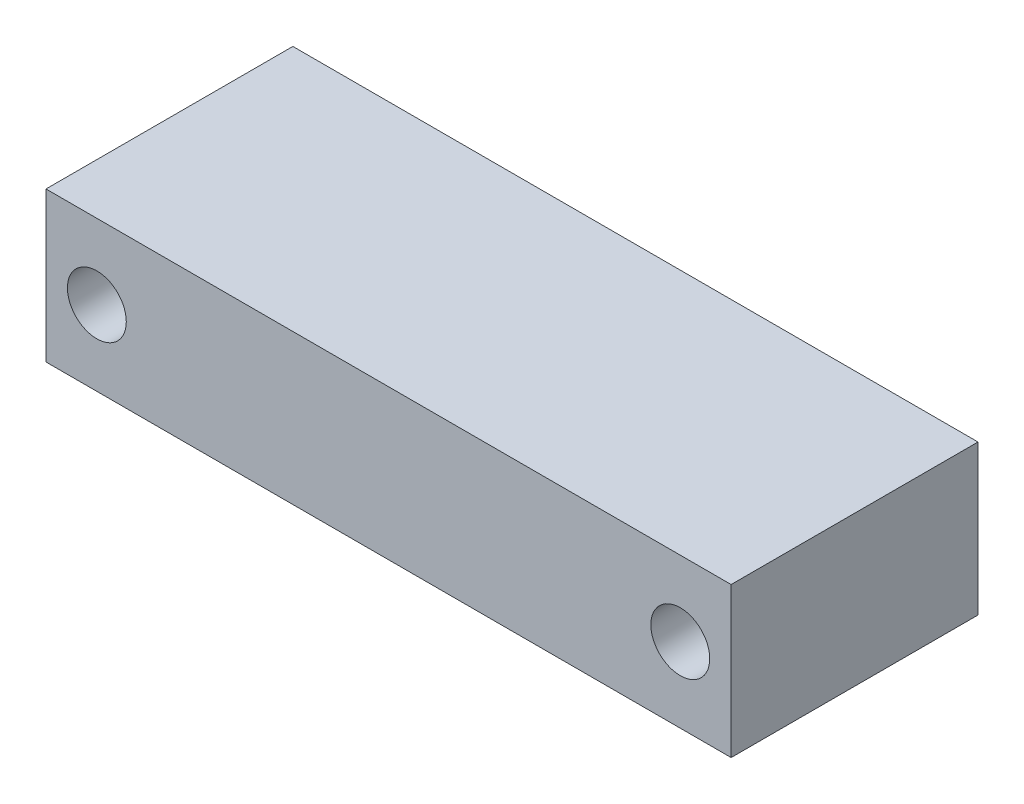
ISO-10303-21;
HEADER;
FILE_DESCRIPTION(('STEP AP214'),'2;1');
FILE_NAME('part.step','',(''),(''),'','','');
FILE_SCHEMA(('AUTOMOTIVE_DESIGN { 1 0 10303 214 1 1 1 1 }'));
ENDSEC;
DATA;
#1=APPLICATION_CONTEXT('core data for automotive mechanical design processes');
#2=APPLICATION_PROTOCOL_DEFINITION('international standard','automotive_design',2000,#1);
#3=PRODUCT_CONTEXT('',#1,'mechanical');
#4=PRODUCT('Part','Part','',(#3));
#5=PRODUCT_RELATED_PRODUCT_CATEGORY('part','',(#4));
#6=PRODUCT_DEFINITION_FORMATION('','',#4);
#7=PRODUCT_DEFINITION_CONTEXT('part definition',#1,'design');
#8=PRODUCT_DEFINITION('design','',#6,#7);
#9=PRODUCT_DEFINITION_SHAPE('','',#8);
#10=(LENGTH_UNIT() NAMED_UNIT(*) SI_UNIT(.MILLI.,.METRE.));
#11=(NAMED_UNIT(*) PLANE_ANGLE_UNIT() SI_UNIT($,.RADIAN.));
#12=(NAMED_UNIT(*) SI_UNIT($,.STERADIAN.) SOLID_ANGLE_UNIT());
#13=UNCERTAINTY_MEASURE_WITH_UNIT(LENGTH_MEASURE(1.E-05),#10,'distance_accuracy_value','');
#14=(GEOMETRIC_REPRESENTATION_CONTEXT(3) GLOBAL_UNCERTAINTY_ASSIGNED_CONTEXT((#13)) GLOBAL_UNIT_ASSIGNED_CONTEXT((#10,
#11,#12)) REPRESENTATION_CONTEXT('',''));
#15=CARTESIAN_POINT('',(0.,0.,0.));
#16=DIRECTION('',(0.,0.,1.));
#17=DIRECTION('',(1.,0.,0.));
#18=AXIS2_PLACEMENT_3D('',#15,#16,#17);
#19=CARTESIAN_POINT('',(0.,0.,23.06));
#20=DIRECTION('',(0.,0.,-1.));
#21=DIRECTION('',(-1.,0.,0.));
#22=AXIS2_PLACEMENT_3D('',#19,#20,#21);
#23=PLANE('',#22);
#24=DIRECTION('',(0.,1.,0.));
#25=VECTOR('',#24,1.);
#26=CARTESIAN_POINT('',(32.,-7.,23.06));
#27=LINE('',#26,#25);
#28=CARTESIAN_POINT('',(32.,-7.,23.06));
#29=VERTEX_POINT('',#28);
#30=CARTESIAN_POINT('',(32.,7.,23.06));
#31=VERTEX_POINT('',#30);
#32=EDGE_CURVE('E86',#29,#31,#27,.T.);
#33=ORIENTED_EDGE('',*,*,#32,.T.);
#34=DIRECTION('',(-1.,0.,0.));
#35=VECTOR('',#34,1.);
#36=CARTESIAN_POINT('',(-32.,7.,23.06));
#37=LINE('',#36,#35);
#38=CARTESIAN_POINT('',(-32.,7.,23.06));
#39=VERTEX_POINT('',#38);
#40=EDGE_CURVE('E81',#31,#39,#37,.T.);
#41=ORIENTED_EDGE('',*,*,#40,.T.);
#42=DIRECTION('',(0.,-1.,0.));
#43=VECTOR('',#42,1.);
#44=CARTESIAN_POINT('',(-32.,-7.,23.06));
#45=LINE('',#44,#43);
#46=CARTESIAN_POINT('',(-32.,-7.,23.06));
#47=VERTEX_POINT('',#46);
#48=EDGE_CURVE('E84',#39,#47,#45,.T.);
#49=ORIENTED_EDGE('',*,*,#48,.T.);
#50=DIRECTION('',(1.,0.,0.));
#51=VECTOR('',#50,1.);
#52=CARTESIAN_POINT('',(-32.,-7.,23.06));
#53=LINE('',#52,#51);
#54=EDGE_CURVE('E51',#47,#29,#53,.T.);
#55=ORIENTED_EDGE('',*,*,#54,.T.);
#56=EDGE_LOOP('',(#33,#41,#49,#55));
#57=FACE_BOUND('',#56,.T.);
#58=CARTESIAN_POINT('',(-27.25,0.,23.06));
#59=DIRECTION('',(0.,0.,1.));
#60=DIRECTION('',(1.,0.,0.));
#61=AXIS2_PLACEMENT_3D('',#58,#59,#60);
#62=CIRCLE('',#61,2.75);
#63=CARTESIAN_POINT('',(-24.5,0.,23.06));
#64=VERTEX_POINT('',#63);
#65=EDGE_CURVE('E101',#64,#64,#62,.T.);
#66=ORIENTED_EDGE('',*,*,#65,.F.);
#67=EDGE_LOOP('',(#66));
#68=FACE_BOUND('',#67,.T.);
#69=CARTESIAN_POINT('',(27.25,0.,23.06));
#70=DIRECTION('',(0.,0.,1.));
#71=DIRECTION('',(1.,0.,0.));
#72=AXIS2_PLACEMENT_3D('',#69,#70,#71);
#73=CIRCLE('',#72,2.75);
#74=CARTESIAN_POINT('',(30.,0.,23.06));
#75=VERTEX_POINT('',#74);
#76=EDGE_CURVE('E116',#75,#75,#73,.T.);
#77=ORIENTED_EDGE('',*,*,#76,.F.);
#78=EDGE_LOOP('',(#77));
#79=FACE_BOUND('',#78,.T.);
#80=ADVANCED_FACE('F34',(#57,#68,#79),#23,.F.);
#81=CARTESIAN_POINT('',(0.,0.,0.));
#82=DIRECTION('',(0.,0.,-1.));
#83=DIRECTION('',(-1.,0.,0.));
#84=AXIS2_PLACEMENT_3D('',#81,#82,#83);
#85=PLANE('',#84);
#86=CARTESIAN_POINT('',(-27.25,0.,0.));
#87=DIRECTION('',(0.,0.,1.));
#88=DIRECTION('',(1.,0.,0.));
#89=AXIS2_PLACEMENT_3D('',#86,#87,#88);
#90=CIRCLE('',#89,2.75);
#91=CARTESIAN_POINT('',(-24.5,0.,0.));
#92=VERTEX_POINT('',#91);
#93=EDGE_CURVE('E113',#92,#92,#90,.T.);
#94=ORIENTED_EDGE('',*,*,#93,.T.);
#95=EDGE_LOOP('',(#94));
#96=FACE_BOUND('',#95,.T.);
#97=DIRECTION('',(0.,1.,0.));
#98=VECTOR('',#97,1.);
#99=CARTESIAN_POINT('',(32.,-7.,0.));
#100=LINE('',#99,#98);
#101=CARTESIAN_POINT('',(32.,-7.,0.));
#102=VERTEX_POINT('',#101);
#103=CARTESIAN_POINT('',(32.,7.,0.));
#104=VERTEX_POINT('',#103);
#105=EDGE_CURVE('E98',#102,#104,#100,.T.);
#106=ORIENTED_EDGE('',*,*,#105,.F.);
#107=DIRECTION('',(1.,0.,0.));
#108=VECTOR('',#107,1.);
#109=CARTESIAN_POINT('',(-32.,-7.,0.));
#110=LINE('',#109,#108);
#111=CARTESIAN_POINT('',(-32.,-7.,0.));
#112=VERTEX_POINT('',#111);
#113=EDGE_CURVE('E74',#112,#102,#110,.T.);
#114=ORIENTED_EDGE('',*,*,#113,.F.);
#115=DIRECTION('',(0.,-1.,0.));
#116=VECTOR('',#115,1.);
#117=CARTESIAN_POINT('',(-32.,-7.,0.));
#118=LINE('',#117,#116);
#119=CARTESIAN_POINT('',(-32.,7.,0.));
#120=VERTEX_POINT('',#119);
#121=EDGE_CURVE('E68',#120,#112,#118,.T.);
#122=ORIENTED_EDGE('',*,*,#121,.F.);
#123=DIRECTION('',(-1.,0.,0.));
#124=VECTOR('',#123,1.);
#125=CARTESIAN_POINT('',(-32.,7.,0.));
#126=LINE('',#125,#124);
#127=EDGE_CURVE('E90',#104,#120,#126,.T.);
#128=ORIENTED_EDGE('',*,*,#127,.F.);
#129=EDGE_LOOP('',(#106,#114,#122,#128));
#130=FACE_BOUND('',#129,.T.);
#131=CARTESIAN_POINT('',(27.25,0.,0.));
#132=DIRECTION('',(0.,0.,1.));
#133=DIRECTION('',(1.,0.,0.));
#134=AXIS2_PLACEMENT_3D('',#131,#132,#133);
#135=CIRCLE('',#134,2.75);
#136=CARTESIAN_POINT('',(30.,0.,0.));
#137=VERTEX_POINT('',#136);
#138=EDGE_CURVE('E119',#137,#137,#135,.T.);
#139=ORIENTED_EDGE('',*,*,#138,.T.);
#140=EDGE_LOOP('',(#139));
#141=FACE_BOUND('',#140,.T.);
#142=ADVANCED_FACE('F109',(#96,#130,#141),#85,.T.);
#143=CARTESIAN_POINT('',(32.,-7.,23.06));
#144=DIRECTION('',(-1.,0.,0.));
#145=DIRECTION('',(0.,0.,1.));
#146=AXIS2_PLACEMENT_3D('',#143,#144,#145);
#147=PLANE('',#146);
#148=ORIENTED_EDGE('',*,*,#105,.T.);
#149=DIRECTION('',(0.,0.,-1.));
#150=VECTOR('',#149,1.);
#151=CARTESIAN_POINT('',(32.,7.,23.06));
#152=LINE('',#151,#150);
#153=EDGE_CURVE('E11',#31,#104,#152,.T.);
#154=ORIENTED_EDGE('',*,*,#153,.F.);
#155=ORIENTED_EDGE('',*,*,#32,.F.);
#156=DIRECTION('',(0.,0.,-1.));
#157=VECTOR('',#156,1.);
#158=CARTESIAN_POINT('',(32.,-7.,23.06));
#159=LINE('',#158,#157);
#160=EDGE_CURVE('E94',#29,#102,#159,.T.);
#161=ORIENTED_EDGE('',*,*,#160,.T.);
#162=EDGE_LOOP('',(#148,#154,#155,#161));
#163=FACE_BOUND('',#162,.T.);
#164=ADVANCED_FACE('F36',(#163),#147,.F.);
#165=CARTESIAN_POINT('',(-32.,7.,23.06));
#166=DIRECTION('',(0.,-1.,0.));
#167=DIRECTION('',(0.,0.,-1.));
#168=AXIS2_PLACEMENT_3D('',#165,#166,#167);
#169=PLANE('',#168);
#170=ORIENTED_EDGE('',*,*,#127,.T.);
#171=DIRECTION('',(0.,0.,-1.));
#172=VECTOR('',#171,1.);
#173=CARTESIAN_POINT('',(-32.,7.,23.06));
#174=LINE('',#173,#172);
#175=EDGE_CURVE('E43',#39,#120,#174,.T.);
#176=ORIENTED_EDGE('',*,*,#175,.F.);
#177=ORIENTED_EDGE('',*,*,#40,.F.);
#178=ORIENTED_EDGE('',*,*,#153,.T.);
#179=EDGE_LOOP('',(#170,#176,#177,#178));
#180=FACE_BOUND('',#179,.T.);
#181=ADVANCED_FACE('F89',(#180),#169,.F.);
#182=CARTESIAN_POINT('',(-32.,-7.,23.06));
#183=DIRECTION('',(1.,0.,0.));
#184=DIRECTION('',(0.,0.,-1.));
#185=AXIS2_PLACEMENT_3D('',#182,#183,#184);
#186=PLANE('',#185);
#187=ORIENTED_EDGE('',*,*,#121,.T.);
#188=DIRECTION('',(0.,0.,-1.));
#189=VECTOR('',#188,1.);
#190=CARTESIAN_POINT('',(-32.,-7.,23.06));
#191=LINE('',#190,#189);
#192=EDGE_CURVE('E91',#47,#112,#191,.T.);
#193=ORIENTED_EDGE('',*,*,#192,.F.);
#194=ORIENTED_EDGE('',*,*,#48,.F.);
#195=ORIENTED_EDGE('',*,*,#175,.T.);
#196=EDGE_LOOP('',(#187,#193,#194,#195));
#197=FACE_BOUND('',#196,.T.);
#198=ADVANCED_FACE('F92',(#197),#186,.F.);
#199=CARTESIAN_POINT('',(-32.,-7.,23.06));
#200=DIRECTION('',(0.,1.,0.));
#201=DIRECTION('',(0.,0.,1.));
#202=AXIS2_PLACEMENT_3D('',#199,#200,#201);
#203=PLANE('',#202);
#204=ORIENTED_EDGE('',*,*,#113,.T.);
#205=ORIENTED_EDGE('',*,*,#160,.F.);
#206=ORIENTED_EDGE('',*,*,#54,.F.);
#207=ORIENTED_EDGE('',*,*,#192,.T.);
#208=EDGE_LOOP('',(#204,#205,#206,#207));
#209=FACE_BOUND('',#208,.T.);
#210=ADVANCED_FACE('F106',(#209),#203,.F.);
#211=CARTESIAN_POINT('',(-27.25,0.,23.06));
#212=DIRECTION('',(0.,0.,-1.));
#213=DIRECTION('',(-1.,0.,0.));
#214=AXIS2_PLACEMENT_3D('',#211,#212,#213);
#215=CYLINDRICAL_SURFACE('',#214,2.75);
#216=ORIENTED_EDGE('',*,*,#65,.T.);
#217=EDGE_LOOP('',(#216));
#218=FACE_BOUND('',#217,.T.);
#219=ORIENTED_EDGE('',*,*,#93,.F.);
#220=EDGE_LOOP('',(#219));
#221=FACE_BOUND('',#220,.T.);
#222=ADVANCED_FACE('F136',(#218,#221),#215,.F.);
#223=CARTESIAN_POINT('',(27.25,0.,23.06));
#224=DIRECTION('',(0.,0.,-1.));
#225=DIRECTION('',(-1.,0.,0.));
#226=AXIS2_PLACEMENT_3D('',#223,#224,#225);
#227=CYLINDRICAL_SURFACE('',#226,2.75);
#228=ORIENTED_EDGE('',*,*,#76,.T.);
#229=EDGE_LOOP('',(#228));
#230=FACE_BOUND('',#229,.T.);
#231=ORIENTED_EDGE('',*,*,#138,.F.);
#232=EDGE_LOOP('',(#231));
#233=FACE_BOUND('',#232,.T.);
#234=ADVANCED_FACE('F125',(#230,#233),#227,.F.);
#235=CLOSED_SHELL('',(#80,#142,#164,#181,#198,#210,#222,#234));
#236=MANIFOLD_SOLID_BREP('B2',#235);
#237=ADVANCED_BREP_SHAPE_REPRESENTATION('',(#18,#236),#14);
#238=SHAPE_DEFINITION_REPRESENTATION(#9,#237);
ENDSEC;
END-ISO-10303-21;
